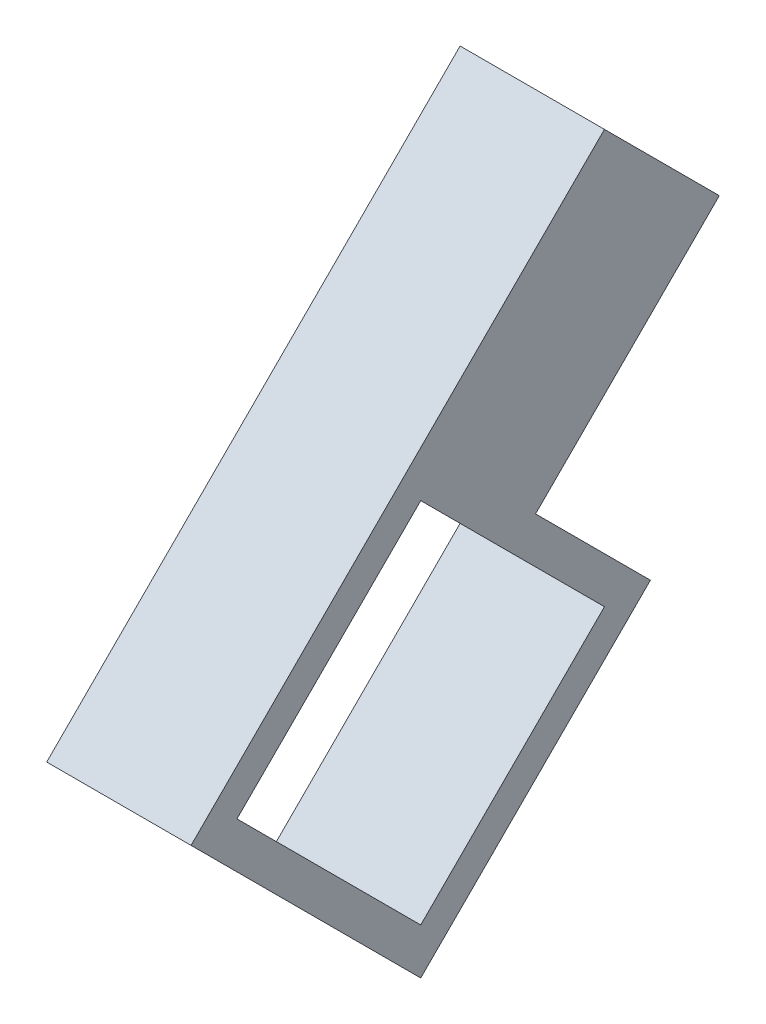
ISO-10303-21;
HEADER;
FILE_DESCRIPTION(('STEP AP214'),'2;1');
FILE_NAME('part.step','',(''),(''),'','','');
FILE_SCHEMA(('AUTOMOTIVE_DESIGN { 1 0 10303 214 1 1 1 1 }'));
ENDSEC;
DATA;
#1=APPLICATION_CONTEXT('core data for automotive mechanical design processes');
#2=APPLICATION_PROTOCOL_DEFINITION('international standard','automotive_design',2000,#1);
#3=PRODUCT_CONTEXT('',#1,'mechanical');
#4=PRODUCT('Part','Part','',(#3));
#5=PRODUCT_RELATED_PRODUCT_CATEGORY('part','',(#4));
#6=PRODUCT_DEFINITION_FORMATION('','',#4);
#7=PRODUCT_DEFINITION_CONTEXT('part definition',#1,'design');
#8=PRODUCT_DEFINITION('design','',#6,#7);
#9=PRODUCT_DEFINITION_SHAPE('','',#8);
#10=(LENGTH_UNIT() NAMED_UNIT(*) SI_UNIT(.MILLI.,.METRE.));
#11=(NAMED_UNIT(*) PLANE_ANGLE_UNIT() SI_UNIT($,.RADIAN.));
#12=(NAMED_UNIT(*) SI_UNIT($,.STERADIAN.) SOLID_ANGLE_UNIT());
#13=UNCERTAINTY_MEASURE_WITH_UNIT(LENGTH_MEASURE(1.E-05),#10,'distance_accuracy_value','');
#14=(GEOMETRIC_REPRESENTATION_CONTEXT(3) GLOBAL_UNCERTAINTY_ASSIGNED_CONTEXT((#13)) GLOBAL_UNIT_ASSIGNED_CONTEXT((#10,
#11,#12)) REPRESENTATION_CONTEXT('',''));
#15=CARTESIAN_POINT('',(0.,0.,0.));
#16=DIRECTION('',(0.,0.,1.));
#17=DIRECTION('',(1.,0.,0.));
#18=AXIS2_PLACEMENT_3D('',#15,#16,#17);
#19=CARTESIAN_POINT('',(20.,0.,31.8198051533947));
#20=DIRECTION('',(0.,-0.707106781186548,-0.707106781186548));
#21=DIRECTION('',(0.,0.707106781186548,-0.707106781186548));
#22=AXIS2_PLACEMENT_3D('',#19,#20,#21);
#23=PLANE('',#22);
#24=DIRECTION('',(0.,-0.707106781186547,0.707106781186547));
#25=VECTOR('',#24,1.);
#26=CARTESIAN_POINT('',(0.,0.,31.8198051533947));
#27=LINE('',#26,#25);
#28=CARTESIAN_POINT('',(0.,57.2756492761104,-25.4558441227157));
#29=VERTEX_POINT('',#28);
#30=CARTESIAN_POINT('',(0.,0.,31.8198051533947));
#31=VERTEX_POINT('',#30);
#32=EDGE_CURVE('E146',#29,#31,#27,.T.);
#33=ORIENTED_EDGE('',*,*,#32,.T.);
#34=DIRECTION('',(-1.,0.,0.));
#35=VECTOR('',#34,1.);
#36=CARTESIAN_POINT('',(20.,0.,31.8198051533947));
#37=LINE('',#36,#35);
#38=CARTESIAN_POINT('',(20.,0.,31.8198051533947));
#39=VERTEX_POINT('',#38);
#40=EDGE_CURVE('E11',#39,#31,#37,.T.);
#41=ORIENTED_EDGE('',*,*,#40,.F.);
#42=DIRECTION('',(0.,-0.707106781186547,0.707106781186548));
#43=VECTOR('',#42,1.);
#44=CARTESIAN_POINT('',(20.,15.9099025766973,15.9099025766973));
#45=LINE('',#44,#43);
#46=CARTESIAN_POINT('',(20.,57.2756492761104,-25.4558441227157));
#47=VERTEX_POINT('',#46);
#48=EDGE_CURVE('E150',#47,#39,#45,.T.);
#49=ORIENTED_EDGE('',*,*,#48,.F.);
#50=DIRECTION('',(-1.,0.,0.));
#51=VECTOR('',#50,1.);
#52=CARTESIAN_POINT('',(20.,57.2756492761104,-25.4558441227157));
#53=LINE('',#52,#51);
#54=EDGE_CURVE('E163',#47,#29,#53,.T.);
#55=ORIENTED_EDGE('',*,*,#54,.T.);
#56=EDGE_LOOP('',(#33,#41,#49,#55));
#57=FACE_BOUND('',#56,.T.);
#58=ADVANCED_FACE('F37',(#57),#23,.F.);
#59=CARTESIAN_POINT('',(20.,-31.8198051533946,0.));
#60=DIRECTION('',(0.,0.707106781186548,-0.707106781186547));
#61=DIRECTION('',(0.,0.707106781186547,0.707106781186548));
#62=AXIS2_PLACEMENT_3D('',#59,#60,#61);
#63=PLANE('',#62);
#64=DIRECTION('',(0.,-0.707106781186547,-0.707106781186548));
#65=VECTOR('',#64,1.);
#66=CARTESIAN_POINT('',(0.,-31.8198051533946,0.));
#67=LINE('',#66,#65);
#68=CARTESIAN_POINT('',(0.,-31.8198051533946,0.));
#69=VERTEX_POINT('',#68);
#70=EDGE_CURVE('E165',#31,#69,#67,.T.);
#71=ORIENTED_EDGE('',*,*,#70,.T.);
#72=DIRECTION('',(-1.,0.,0.));
#73=VECTOR('',#72,1.);
#74=CARTESIAN_POINT('',(20.,-31.8198051533946,0.));
#75=LINE('',#74,#73);
#76=CARTESIAN_POINT('',(20.,-31.8198051533946,0.));
#77=VERTEX_POINT('',#76);
#78=EDGE_CURVE('E44',#77,#69,#75,.T.);
#79=ORIENTED_EDGE('',*,*,#78,.F.);
#80=DIRECTION('',(0.,-0.707106781186547,-0.707106781186548));
#81=VECTOR('',#80,1.);
#82=CARTESIAN_POINT('',(20.,-31.8198051533946,0.));
#83=LINE('',#82,#81);
#84=EDGE_CURVE('E152',#39,#77,#83,.T.);
#85=ORIENTED_EDGE('',*,*,#84,.F.);
#86=ORIENTED_EDGE('',*,*,#40,.T.);
#87=EDGE_LOOP('',(#71,#79,#85,#86));
#88=FACE_BOUND('',#87,.T.);
#89=ADVANCED_FACE('F212',(#88),#63,.F.);
#90=CARTESIAN_POINT('',(20.,-31.8198051533946,0.));
#91=DIRECTION('',(0.,0.707106781186547,0.707106781186548));
#92=DIRECTION('',(0.,-0.707106781186548,0.707106781186547));
#93=AXIS2_PLACEMENT_3D('',#90,#91,#92);
#94=PLANE('',#93);
#95=DIRECTION('',(0.,0.707106781186547,-0.707106781186547));
#96=VECTOR('',#95,1.);
#97=CARTESIAN_POINT('',(0.,-31.8198051533946,0.));
#98=LINE('',#97,#96);
#99=CARTESIAN_POINT('',(0.,0.,-31.8198051533946));
#100=VERTEX_POINT('',#99);
#101=EDGE_CURVE('E167',#69,#100,#98,.T.);
#102=ORIENTED_EDGE('',*,*,#101,.T.);
#103=DIRECTION('',(-1.,0.,0.));
#104=VECTOR('',#103,1.);
#105=CARTESIAN_POINT('',(20.,0.,-31.8198051533946));
#106=LINE('',#105,#104);
#107=CARTESIAN_POINT('',(20.,0.,-31.8198051533946));
#108=VERTEX_POINT('',#107);
#109=EDGE_CURVE('E183',#108,#100,#106,.T.);
#110=ORIENTED_EDGE('',*,*,#109,.F.);
#111=DIRECTION('',(0.,0.707106781186547,-0.707106781186547));
#112=VECTOR('',#111,1.);
#113=CARTESIAN_POINT('',(20.,-31.8198051533946,0.));
#114=LINE('',#113,#112);
#115=EDGE_CURVE('E155',#77,#108,#114,.T.);
#116=ORIENTED_EDGE('',*,*,#115,.F.);
#117=ORIENTED_EDGE('',*,*,#78,.T.);
#118=EDGE_LOOP('',(#102,#110,#116,#117));
#119=FACE_BOUND('',#118,.T.);
#120=ADVANCED_FACE('F190',(#119),#94,.F.);
#121=CARTESIAN_POINT('',(20.,0.,-31.8198051533946));
#122=DIRECTION('',(0.,-0.707106781186548,0.707106781186547));
#123=DIRECTION('',(0.,-0.707106781186547,-0.707106781186548));
#124=AXIS2_PLACEMENT_3D('',#121,#122,#123);
#125=PLANE('',#124);
#126=DIRECTION('',(0.,0.707106781186547,0.707106781186548));
#127=VECTOR('',#126,1.);
#128=CARTESIAN_POINT('',(0.,0.,-31.8198051533946));
#129=LINE('',#128,#127);
#130=CARTESIAN_POINT('',(0.,15.9099025766973,-15.9099025766973));
#131=VERTEX_POINT('',#130);
#132=EDGE_CURVE('E169',#100,#131,#129,.T.);
#133=ORIENTED_EDGE('',*,*,#132,.T.);
#134=DIRECTION('',(-1.,0.,0.));
#135=VECTOR('',#134,1.);
#136=CARTESIAN_POINT('',(20.,15.9099025766973,-15.9099025766973));
#137=LINE('',#136,#135);
#138=CARTESIAN_POINT('',(20.,15.9099025766973,-15.9099025766973));
#139=VERTEX_POINT('',#138);
#140=EDGE_CURVE('E180',#139,#131,#137,.T.);
#141=ORIENTED_EDGE('',*,*,#140,.F.);
#142=DIRECTION('',(0.,0.707106781186547,0.707106781186548));
#143=VECTOR('',#142,1.);
#144=CARTESIAN_POINT('',(20.,0.,-31.8198051533946));
#145=LINE('',#144,#143);
#146=EDGE_CURVE('E157',#108,#139,#145,.T.);
#147=ORIENTED_EDGE('',*,*,#146,.F.);
#148=ORIENTED_EDGE('',*,*,#109,.T.);
#149=EDGE_LOOP('',(#133,#141,#147,#148));
#150=FACE_BOUND('',#149,.T.);
#151=ADVANCED_FACE('F200',(#150),#125,.F.);
#152=CARTESIAN_POINT('',(20.,41.365746699413,-41.365746699413));
#153=DIRECTION('',(0.,0.707106781186547,0.707106781186548));
#154=DIRECTION('',(0.,-0.707106781186548,0.707106781186547));
#155=AXIS2_PLACEMENT_3D('',#152,#153,#154);
#156=PLANE('',#155);
#157=DIRECTION('',(0.,0.707106781186548,-0.707106781186547));
#158=VECTOR('',#157,1.);
#159=CARTESIAN_POINT('',(0.,41.365746699413,-41.365746699413));
#160=LINE('',#159,#158);
#161=CARTESIAN_POINT('',(0.,41.365746699413,-41.365746699413));
#162=VERTEX_POINT('',#161);
#163=EDGE_CURVE('E171',#131,#162,#160,.T.);
#164=ORIENTED_EDGE('',*,*,#163,.T.);
#165=DIRECTION('',(-1.,0.,0.));
#166=VECTOR('',#165,1.);
#167=CARTESIAN_POINT('',(20.,41.365746699413,-41.365746699413));
#168=LINE('',#167,#166);
#169=CARTESIAN_POINT('',(20.,41.365746699413,-41.365746699413));
#170=VERTEX_POINT('',#169);
#171=EDGE_CURVE('E177',#170,#162,#168,.T.);
#172=ORIENTED_EDGE('',*,*,#171,.F.);
#173=DIRECTION('',(0.,0.707106781186548,-0.707106781186547));
#174=VECTOR('',#173,1.);
#175=CARTESIAN_POINT('',(20.,41.365746699413,-41.365746699413));
#176=LINE('',#175,#174);
#177=EDGE_CURVE('E159',#139,#170,#176,.T.);
#178=ORIENTED_EDGE('',*,*,#177,.F.);
#179=ORIENTED_EDGE('',*,*,#140,.T.);
#180=EDGE_LOOP('',(#164,#172,#178,#179));
#181=FACE_BOUND('',#180,.T.);
#182=ADVANCED_FACE('F204',(#181),#156,.F.);
#183=CARTESIAN_POINT('',(20.,57.2756492761104,-25.4558441227157));
#184=DIRECTION('',(0.,-0.707106781186547,0.707106781186548));
#185=DIRECTION('',(0.,-0.707106781186548,-0.707106781186547));
#186=AXIS2_PLACEMENT_3D('',#183,#184,#185);
#187=PLANE('',#186);
#188=DIRECTION('',(0.,0.707106781186548,0.707106781186547));
#189=VECTOR('',#188,1.);
#190=CARTESIAN_POINT('',(0.,57.2756492761104,-25.4558441227157));
#191=LINE('',#190,#189);
#192=EDGE_CURVE('E153',#162,#29,#191,.T.);
#193=ORIENTED_EDGE('',*,*,#192,.T.);
#194=ORIENTED_EDGE('',*,*,#54,.F.);
#195=DIRECTION('',(0.,0.707106781186548,0.707106781186547));
#196=VECTOR('',#195,1.);
#197=CARTESIAN_POINT('',(20.,57.2756492761104,-25.4558441227157));
#198=LINE('',#197,#196);
#199=EDGE_CURVE('E161',#170,#47,#198,.T.);
#200=ORIENTED_EDGE('',*,*,#199,.F.);
#201=ORIENTED_EDGE('',*,*,#171,.T.);
#202=EDGE_LOOP('',(#193,#194,#200,#201));
#203=FACE_BOUND('',#202,.T.);
#204=ADVANCED_FACE('F215',(#203),#187,.F.);
#205=CARTESIAN_POINT('',(20.,0.,0.));
#206=DIRECTION('',(-1.,0.,0.));
#207=DIRECTION('',(0.,0.,1.));
#208=AXIS2_PLACEMENT_3D('',#205,#206,#207);
#209=PLANE('',#208);
#210=DIRECTION('',(0.,0.707106781186547,-0.707106781186548));
#211=VECTOR('',#210,1.);
#212=CARTESIAN_POINT('',(20.,-25.4558441227157,0.));
#213=LINE('',#212,#211);
#214=CARTESIAN_POINT('',(20.,-25.4558441227157,0.));
#215=VERTEX_POINT('',#214);
#216=CARTESIAN_POINT('',(20.,0.,-25.4558441227157));
#217=VERTEX_POINT('',#216);
#218=EDGE_CURVE('E140',#215,#217,#213,.T.);
#219=ORIENTED_EDGE('',*,*,#218,.F.);
#220=DIRECTION('',(0.,-0.707106781186547,-0.707106781186548));
#221=VECTOR('',#220,1.);
#222=CARTESIAN_POINT('',(20.,-25.4558441227157,0.));
#223=LINE('',#222,#221);
#224=CARTESIAN_POINT('',(20.,0.,25.4558441227157));
#225=VERTEX_POINT('',#224);
#226=EDGE_CURVE('E51',#225,#215,#223,.T.);
#227=ORIENTED_EDGE('',*,*,#226,.F.);
#228=DIRECTION('',(0.,-0.707106781186547,0.707106781186548));
#229=VECTOR('',#228,1.);
#230=CARTESIAN_POINT('',(20.,0.,25.4558441227157));
#231=LINE('',#230,#229);
#232=CARTESIAN_POINT('',(20.,25.4558441227157,0.));
#233=VERTEX_POINT('',#232);
#234=EDGE_CURVE('E131',#233,#225,#231,.T.);
#235=ORIENTED_EDGE('',*,*,#234,.F.);
#236=DIRECTION('',(0.,0.707106781186547,0.707106781186548));
#237=VECTOR('',#236,1.);
#238=CARTESIAN_POINT('',(20.,0.,-25.4558441227157));
#239=LINE('',#238,#237);
#240=EDGE_CURVE('E134',#217,#233,#239,.T.);
#241=ORIENTED_EDGE('',*,*,#240,.F.);
#242=EDGE_LOOP('',(#219,#227,#235,#241));
#243=FACE_BOUND('',#242,.T.);
#244=ORIENTED_EDGE('',*,*,#48,.T.);
#245=ORIENTED_EDGE('',*,*,#84,.T.);
#246=ORIENTED_EDGE('',*,*,#115,.T.);
#247=ORIENTED_EDGE('',*,*,#146,.T.);
#248=ORIENTED_EDGE('',*,*,#177,.T.);
#249=ORIENTED_EDGE('',*,*,#199,.T.);
#250=EDGE_LOOP('',(#244,#245,#246,#247,#248,#249));
#251=FACE_BOUND('',#250,.T.);
#252=ADVANCED_FACE('F208',(#243,#251),#209,.F.);
#253=CARTESIAN_POINT('',(0.,0.,0.));
#254=DIRECTION('',(-1.,0.,0.));
#255=DIRECTION('',(0.,0.,1.));
#256=AXIS2_PLACEMENT_3D('',#253,#254,#255);
#257=PLANE('',#256);
#258=DIRECTION('',(0.,-0.707106781186547,-0.707106781186548));
#259=VECTOR('',#258,1.);
#260=CARTESIAN_POINT('',(0.,-25.4558441227157,0.));
#261=LINE('',#260,#259);
#262=CARTESIAN_POINT('',(0.,0.,25.4558441227157));
#263=VERTEX_POINT('',#262);
#264=CARTESIAN_POINT('',(0.,-25.4558441227157,0.));
#265=VERTEX_POINT('',#264);
#266=EDGE_CURVE('E115',#263,#265,#261,.T.);
#267=ORIENTED_EDGE('',*,*,#266,.T.);
#268=DIRECTION('',(0.,0.707106781186547,-0.707106781186548));
#269=VECTOR('',#268,1.);
#270=CARTESIAN_POINT('',(0.,-25.4558441227157,0.));
#271=LINE('',#270,#269);
#272=CARTESIAN_POINT('',(0.,0.,-25.4558441227157));
#273=VERTEX_POINT('',#272);
#274=EDGE_CURVE('E124',#265,#273,#271,.T.);
#275=ORIENTED_EDGE('',*,*,#274,.T.);
#276=DIRECTION('',(0.,0.707106781186547,0.707106781186548));
#277=VECTOR('',#276,1.);
#278=CARTESIAN_POINT('',(0.,0.,-25.4558441227157));
#279=LINE('',#278,#277);
#280=CARTESIAN_POINT('',(0.,25.4558441227157,0.));
#281=VERTEX_POINT('',#280);
#282=EDGE_CURVE('E59',#273,#281,#279,.T.);
#283=ORIENTED_EDGE('',*,*,#282,.T.);
#284=DIRECTION('',(0.,-0.707106781186547,0.707106781186548));
#285=VECTOR('',#284,1.);
#286=CARTESIAN_POINT('',(0.,0.,25.4558441227157));
#287=LINE('',#286,#285);
#288=EDGE_CURVE('E121',#281,#263,#287,.T.);
#289=ORIENTED_EDGE('',*,*,#288,.T.);
#290=EDGE_LOOP('',(#267,#275,#283,#289));
#291=FACE_BOUND('',#290,.T.);
#292=ORIENTED_EDGE('',*,*,#32,.F.);
#293=ORIENTED_EDGE('',*,*,#192,.F.);
#294=ORIENTED_EDGE('',*,*,#163,.F.);
#295=ORIENTED_EDGE('',*,*,#132,.F.);
#296=ORIENTED_EDGE('',*,*,#101,.F.);
#297=ORIENTED_EDGE('',*,*,#70,.F.);
#298=EDGE_LOOP('',(#292,#293,#294,#295,#296,#297));
#299=FACE_BOUND('',#298,.T.);
#300=ADVANCED_FACE('F128',(#291,#299),#257,.T.);
#301=CARTESIAN_POINT('',(0.,-25.4558441227157,0.));
#302=DIRECTION('',(0.,-0.707106781186548,0.707106781186547));
#303=DIRECTION('',(0.,-0.707106781186547,-0.707106781186548));
#304=AXIS2_PLACEMENT_3D('',#301,#302,#303);
#305=PLANE('',#304);
#306=ORIENTED_EDGE('',*,*,#226,.T.);
#307=DIRECTION('',(1.,0.,0.));
#308=VECTOR('',#307,1.);
#309=CARTESIAN_POINT('',(0.,-25.4558441227157,0.));
#310=LINE('',#309,#308);
#311=EDGE_CURVE('E111',#265,#215,#310,.T.);
#312=ORIENTED_EDGE('',*,*,#311,.F.);
#313=ORIENTED_EDGE('',*,*,#266,.F.);
#314=DIRECTION('',(1.,0.,0.));
#315=VECTOR('',#314,1.);
#316=CARTESIAN_POINT('',(0.,0.,25.4558441227157));
#317=LINE('',#316,#315);
#318=EDGE_CURVE('E144',#263,#225,#317,.T.);
#319=ORIENTED_EDGE('',*,*,#318,.T.);
#320=EDGE_LOOP('',(#306,#312,#313,#319));
#321=FACE_BOUND('',#320,.T.);
#322=ADVANCED_FACE('F113',(#321),#305,.F.);
#323=CARTESIAN_POINT('',(0.,0.,25.4558441227157));
#324=DIRECTION('',(0.,0.707106781186548,0.707106781186547));
#325=DIRECTION('',(0.,-0.707106781186547,0.707106781186548));
#326=AXIS2_PLACEMENT_3D('',#323,#324,#325);
#327=PLANE('',#326);
#328=ORIENTED_EDGE('',*,*,#234,.T.);
#329=ORIENTED_EDGE('',*,*,#318,.F.);
#330=ORIENTED_EDGE('',*,*,#288,.F.);
#331=DIRECTION('',(1.,0.,0.));
#332=VECTOR('',#331,1.);
#333=CARTESIAN_POINT('',(0.,25.4558441227157,0.));
#334=LINE('',#333,#332);
#335=EDGE_CURVE('E147',#281,#233,#334,.T.);
#336=ORIENTED_EDGE('',*,*,#335,.T.);
#337=EDGE_LOOP('',(#328,#329,#330,#336));
#338=FACE_BOUND('',#337,.T.);
#339=ADVANCED_FACE('F270',(#338),#327,.F.);
#340=CARTESIAN_POINT('',(0.,0.,-25.4558441227157));
#341=DIRECTION('',(0.,0.707106781186548,-0.707106781186547));
#342=DIRECTION('',(0.,0.707106781186547,0.707106781186548));
#343=AXIS2_PLACEMENT_3D('',#340,#341,#342);
#344=PLANE('',#343);
#345=ORIENTED_EDGE('',*,*,#240,.T.);
#346=ORIENTED_EDGE('',*,*,#335,.F.);
#347=ORIENTED_EDGE('',*,*,#282,.F.);
#348=DIRECTION('',(1.,0.,0.));
#349=VECTOR('',#348,1.);
#350=CARTESIAN_POINT('',(0.,0.,-25.4558441227157));
#351=LINE('',#350,#349);
#352=EDGE_CURVE('E120',#273,#217,#351,.T.);
#353=ORIENTED_EDGE('',*,*,#352,.T.);
#354=EDGE_LOOP('',(#345,#346,#347,#353));
#355=FACE_BOUND('',#354,.T.);
#356=ADVANCED_FACE('F279',(#355),#344,.F.);
#357=CARTESIAN_POINT('',(0.,-25.4558441227157,0.));
#358=DIRECTION('',(0.,-0.707106781186548,-0.707106781186547));
#359=DIRECTION('',(0.,0.707106781186547,-0.707106781186548));
#360=AXIS2_PLACEMENT_3D('',#357,#358,#359);
#361=PLANE('',#360);
#362=ORIENTED_EDGE('',*,*,#218,.T.);
#363=ORIENTED_EDGE('',*,*,#352,.F.);
#364=ORIENTED_EDGE('',*,*,#274,.F.);
#365=ORIENTED_EDGE('',*,*,#311,.T.);
#366=EDGE_LOOP('',(#362,#363,#364,#365));
#367=FACE_BOUND('',#366,.T.);
#368=ADVANCED_FACE('F125',(#367),#361,.F.);
#369=CLOSED_SHELL('',(#58,#89,#120,#151,#182,#204,#252,#300,#322,#339,#356,#368));
#370=MANIFOLD_SOLID_BREP('B2',#369);
#371=ADVANCED_BREP_SHAPE_REPRESENTATION('',(#18,#370),#14);
#372=SHAPE_DEFINITION_REPRESENTATION(#9,#371);
ENDSEC;
END-ISO-10303-21;
